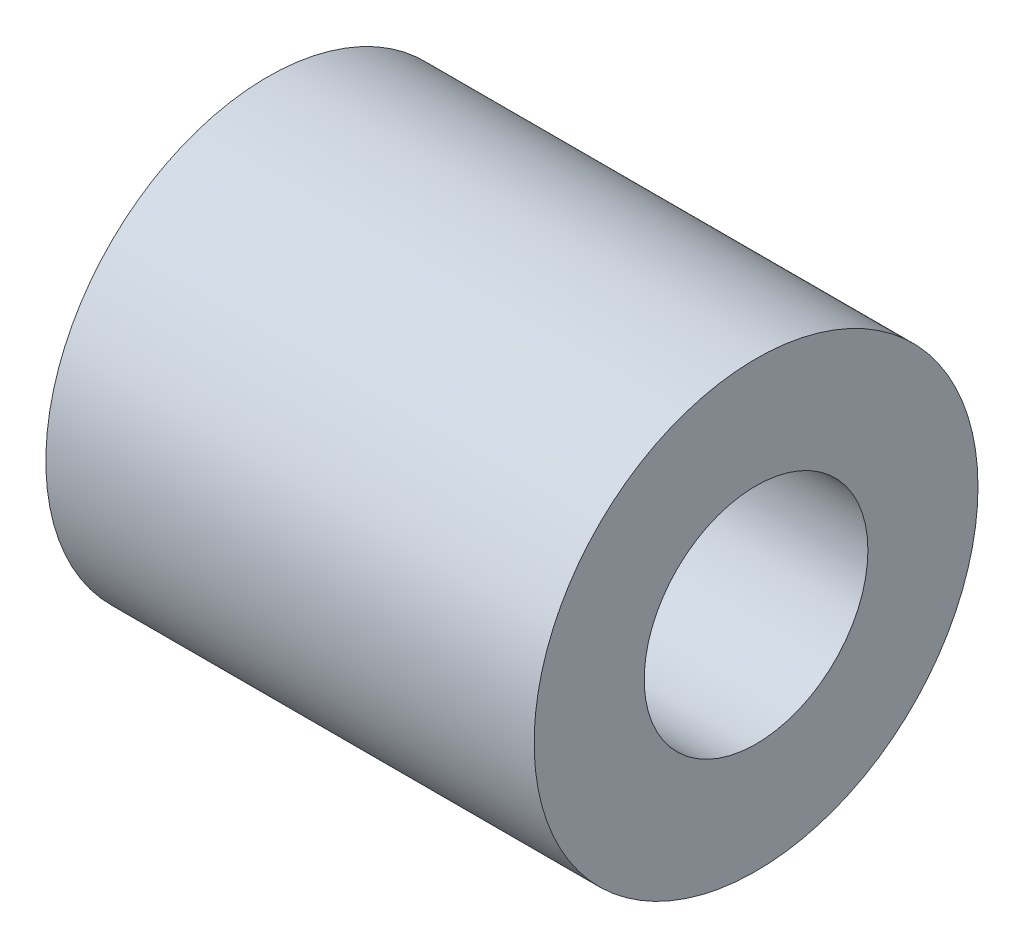
ISO-10303-21;
HEADER;
FILE_DESCRIPTION(('STEP AP214'),'2;1');
FILE_NAME('part.step','',(''),(''),'','','');
FILE_SCHEMA(('AUTOMOTIVE_DESIGN { 1 0 10303 214 1 1 1 1 }'));
ENDSEC;
DATA;
#1=APPLICATION_CONTEXT('core data for automotive mechanical design processes');
#2=APPLICATION_PROTOCOL_DEFINITION('international standard','automotive_design',2000,#1);
#3=PRODUCT_CONTEXT('',#1,'mechanical');
#4=PRODUCT('Part','Part','',(#3));
#5=PRODUCT_RELATED_PRODUCT_CATEGORY('part','',(#4));
#6=PRODUCT_DEFINITION_FORMATION('','',#4);
#7=PRODUCT_DEFINITION_CONTEXT('part definition',#1,'design');
#8=PRODUCT_DEFINITION('design','',#6,#7);
#9=PRODUCT_DEFINITION_SHAPE('','',#8);
#10=(LENGTH_UNIT() NAMED_UNIT(*) SI_UNIT(.MILLI.,.METRE.));
#11=(NAMED_UNIT(*) PLANE_ANGLE_UNIT() SI_UNIT($,.RADIAN.));
#12=(NAMED_UNIT(*) SI_UNIT($,.STERADIAN.) SOLID_ANGLE_UNIT());
#13=UNCERTAINTY_MEASURE_WITH_UNIT(LENGTH_MEASURE(1.E-05),#10,'distance_accuracy_value','');
#14=(GEOMETRIC_REPRESENTATION_CONTEXT(3) GLOBAL_UNCERTAINTY_ASSIGNED_CONTEXT((#13)) GLOBAL_UNIT_ASSIGNED_CONTEXT((#10,
#11,#12)) REPRESENTATION_CONTEXT('',''));
#15=CARTESIAN_POINT('',(0.,0.,0.));
#16=DIRECTION('',(0.,0.,1.));
#17=DIRECTION('',(1.,0.,0.));
#18=AXIS2_PLACEMENT_3D('',#15,#16,#17);
#19=CARTESIAN_POINT('',(0.,0.,0.));
#20=DIRECTION('',(1.,0.,0.));
#21=DIRECTION('',(0.,0.,-1.));
#22=AXIS2_PLACEMENT_3D('',#19,#20,#21);
#23=CYLINDRICAL_SURFACE('',#22,3.2004);
#24=CARTESIAN_POINT('',(0.,0.,0.));
#25=DIRECTION('',(1.,0.,0.));
#26=DIRECTION('',(0.,0.,-1.));
#27=AXIS2_PLACEMENT_3D('',#24,#25,#26);
#28=CIRCLE('',#27,3.2004);
#29=CARTESIAN_POINT('',(0.,0.,-3.2004));
#30=VERTEX_POINT('',#29);
#31=EDGE_CURVE('E10',#30,#30,#28,.T.);
#32=ORIENTED_EDGE('',*,*,#31,.T.);
#33=EDGE_LOOP('',(#32));
#34=FACE_BOUND('',#33,.T.);
#35=CARTESIAN_POINT('',(-13.97,0.,0.));
#36=DIRECTION('',(1.,0.,0.));
#37=DIRECTION('',(0.,0.,-1.));
#38=AXIS2_PLACEMENT_3D('',#35,#36,#37);
#39=CIRCLE('',#38,3.2004);
#40=CARTESIAN_POINT('',(-13.97,0.,-3.2004));
#41=VERTEX_POINT('',#40);
#42=EDGE_CURVE('E53',#41,#41,#39,.T.);
#43=ORIENTED_EDGE('',*,*,#42,.F.);
#44=EDGE_LOOP('',(#43));
#45=FACE_BOUND('',#44,.T.);
#46=ADVANCED_FACE('F39',(#34,#45),#23,.F.);
#47=CARTESIAN_POINT('',(0.,3.2004,0.));
#48=DIRECTION('',(1.,0.,0.));
#49=DIRECTION('',(0.,0.,-1.));
#50=AXIS2_PLACEMENT_3D('',#47,#48,#49);
#51=PLANE('',#50);
#52=CARTESIAN_POINT('',(0.,0.,0.));
#53=DIRECTION('',(1.,0.,0.));
#54=DIRECTION('',(0.,0.,-1.));
#55=AXIS2_PLACEMENT_3D('',#52,#53,#54);
#56=CIRCLE('',#55,6.35);
#57=CARTESIAN_POINT('',(0.,0.,-6.35));
#58=VERTEX_POINT('',#57);
#59=EDGE_CURVE('E45',#58,#58,#56,.T.);
#60=ORIENTED_EDGE('',*,*,#59,.T.);
#61=EDGE_LOOP('',(#60));
#62=FACE_BOUND('',#61,.T.);
#63=ORIENTED_EDGE('',*,*,#31,.F.);
#64=EDGE_LOOP('',(#63));
#65=FACE_BOUND('',#64,.T.);
#66=ADVANCED_FACE('F63',(#62,#65),#51,.T.);
#67=CARTESIAN_POINT('',(0.,0.,0.));
#68=DIRECTION('',(1.,0.,0.));
#69=DIRECTION('',(0.,0.,-1.));
#70=AXIS2_PLACEMENT_3D('',#67,#68,#69);
#71=CYLINDRICAL_SURFACE('',#70,6.35);
#72=CARTESIAN_POINT('',(-13.97,0.,0.));
#73=DIRECTION('',(1.,0.,0.));
#74=DIRECTION('',(0.,0.,-1.));
#75=AXIS2_PLACEMENT_3D('',#72,#73,#74);
#76=CIRCLE('',#75,6.35);
#77=CARTESIAN_POINT('',(-13.97,0.,-6.35));
#78=VERTEX_POINT('',#77);
#79=EDGE_CURVE('E49',#78,#78,#76,.T.);
#80=ORIENTED_EDGE('',*,*,#79,.T.);
#81=EDGE_LOOP('',(#80));
#82=FACE_BOUND('',#81,.T.);
#83=ORIENTED_EDGE('',*,*,#59,.F.);
#84=EDGE_LOOP('',(#83));
#85=FACE_BOUND('',#84,.T.);
#86=ADVANCED_FACE('F67',(#82,#85),#71,.T.);
#87=CARTESIAN_POINT('',(-13.97,6.35,0.));
#88=DIRECTION('',(-1.,0.,0.));
#89=DIRECTION('',(0.,0.,1.));
#90=AXIS2_PLACEMENT_3D('',#87,#88,#89);
#91=PLANE('',#90);
#92=ORIENTED_EDGE('',*,*,#42,.T.);
#93=EDGE_LOOP('',(#92));
#94=FACE_BOUND('',#93,.T.);
#95=ORIENTED_EDGE('',*,*,#79,.F.);
#96=EDGE_LOOP('',(#95));
#97=FACE_BOUND('',#96,.T.);
#98=ADVANCED_FACE('F59',(#94,#97),#91,.T.);
#99=CLOSED_SHELL('',(#46,#66,#86,#98));
#100=MANIFOLD_SOLID_BREP('B2',#99);
#101=ADVANCED_BREP_SHAPE_REPRESENTATION('',(#18,#100),#14);
#102=SHAPE_DEFINITION_REPRESENTATION(#9,#101);
ENDSEC;
END-ISO-10303-21;
